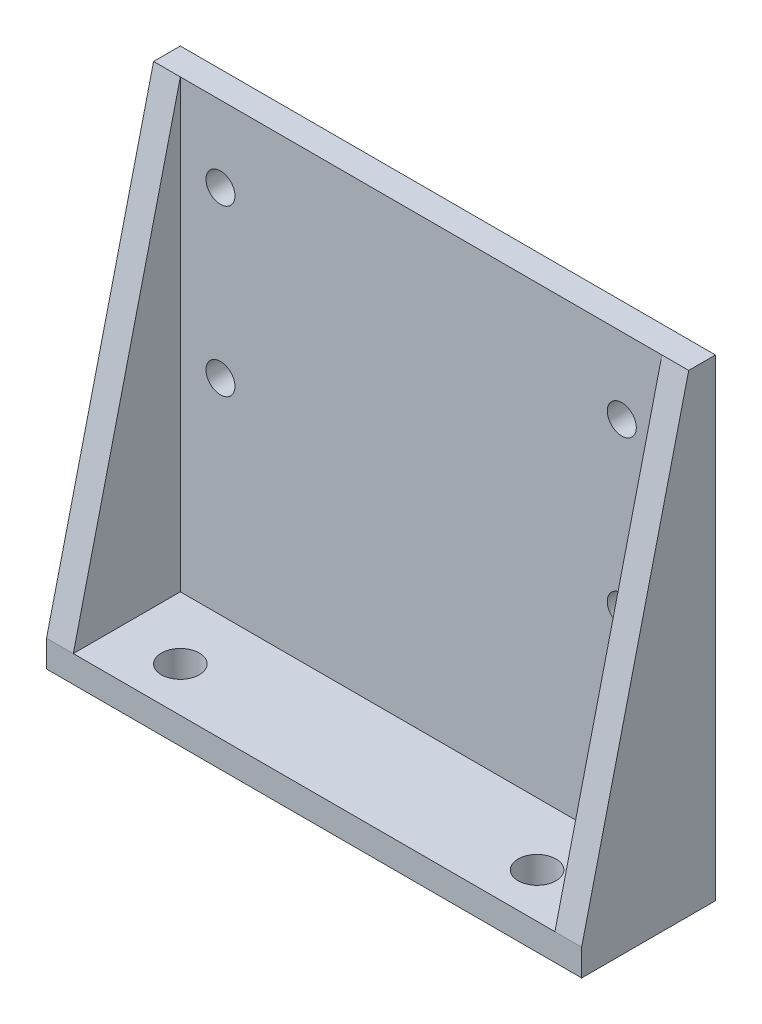
ISO-10303-21;
HEADER;
FILE_DESCRIPTION(('STEP AP214'),'2;1');
FILE_NAME('part.step','',(''),(''),'','','');
FILE_SCHEMA(('AUTOMOTIVE_DESIGN { 1 0 10303 214 1 1 1 1 }'));
ENDSEC;
DATA;
#1=APPLICATION_CONTEXT('core data for automotive mechanical design processes');
#2=APPLICATION_PROTOCOL_DEFINITION('international standard','automotive_design',2000,#1);
#3=PRODUCT_CONTEXT('',#1,'mechanical');
#4=PRODUCT('Part','Part','',(#3));
#5=PRODUCT_RELATED_PRODUCT_CATEGORY('part','',(#4));
#6=PRODUCT_DEFINITION_FORMATION('','',#4);
#7=PRODUCT_DEFINITION_CONTEXT('part definition',#1,'design');
#8=PRODUCT_DEFINITION('design','',#6,#7);
#9=PRODUCT_DEFINITION_SHAPE('','',#8);
#10=(LENGTH_UNIT() NAMED_UNIT(*) SI_UNIT(.MILLI.,.METRE.));
#11=(NAMED_UNIT(*) PLANE_ANGLE_UNIT() SI_UNIT($,.RADIAN.));
#12=(NAMED_UNIT(*) SI_UNIT($,.STERADIAN.) SOLID_ANGLE_UNIT());
#13=UNCERTAINTY_MEASURE_WITH_UNIT(LENGTH_MEASURE(1.E-05),#10,'distance_accuracy_value','');
#14=(GEOMETRIC_REPRESENTATION_CONTEXT(3) GLOBAL_UNCERTAINTY_ASSIGNED_CONTEXT((#13)) GLOBAL_UNIT_ASSIGNED_CONTEXT((#10,
#11,#12)) REPRESENTATION_CONTEXT('',''));
#15=CARTESIAN_POINT('',(0.,0.,0.));
#16=DIRECTION('',(0.,0.,1.));
#17=DIRECTION('',(1.,0.,0.));
#18=AXIS2_PLACEMENT_3D('',#15,#16,#17);
#19=CARTESIAN_POINT('',(0.,3.,0.));
#20=DIRECTION('',(0.,-1.,0.));
#21=DIRECTION('',(0.,0.,-1.));
#22=AXIS2_PLACEMENT_3D('',#19,#20,#21);
#23=PLANE('',#22);
#24=CARTESIAN_POINT('',(10.,3.,-5.));
#25=DIRECTION('',(0.,1.,0.));
#26=DIRECTION('',(0.,0.,1.));
#27=AXIS2_PLACEMENT_3D('',#24,#25,#26);
#28=CIRCLE('',#27,2.125);
#29=CARTESIAN_POINT('',(10.,3.,-2.875));
#30=VERTEX_POINT('',#29);
#31=EDGE_CURVE('E161',#30,#30,#28,.T.);
#32=ORIENTED_EDGE('',*,*,#31,.F.);
#33=EDGE_LOOP('',(#32));
#34=FACE_BOUND('',#33,.T.);
#35=CARTESIAN_POINT('',(50.,3.,-5.00000000000001));
#36=DIRECTION('',(0.,1.,0.));
#37=DIRECTION('',(0.,0.,-1.));
#38=AXIS2_PLACEMENT_3D('',#35,#36,#37);
#39=CIRCLE('',#38,2.125);
#40=CARTESIAN_POINT('',(50.,3.,-7.12500000000001));
#41=VERTEX_POINT('',#40);
#42=EDGE_CURVE('E155',#41,#41,#39,.T.);
#43=ORIENTED_EDGE('',*,*,#42,.F.);
#44=EDGE_LOOP('',(#43));
#45=FACE_BOUND('',#44,.T.);
#46=DIRECTION('',(0.,0.,1.));
#47=VECTOR('',#46,1.);
#48=CARTESIAN_POINT('',(57.,3.,0.));
#49=LINE('',#48,#47);
#50=CARTESIAN_POINT('',(57.,3.,-12.));
#51=VERTEX_POINT('',#50);
#52=CARTESIAN_POINT('',(57.,3.,0.));
#53=VERTEX_POINT('',#52);
#54=EDGE_CURVE('E112',#51,#53,#49,.T.);
#55=ORIENTED_EDGE('',*,*,#54,.F.);
#56=DIRECTION('',(-1.,0.,0.));
#57=VECTOR('',#56,1.);
#58=CARTESIAN_POINT('',(60.,3.,-12.));
#59=LINE('',#58,#57);
#60=CARTESIAN_POINT('',(3.,3.,-12.));
#61=VERTEX_POINT('',#60);
#62=EDGE_CURVE('E134',#51,#61,#59,.T.);
#63=ORIENTED_EDGE('',*,*,#62,.T.);
#64=DIRECTION('',(0.,0.,1.));
#65=VECTOR('',#64,1.);
#66=CARTESIAN_POINT('',(3.,3.,0.));
#67=LINE('',#66,#65);
#68=CARTESIAN_POINT('',(3.,3.,0.));
#69=VERTEX_POINT('',#68);
#70=EDGE_CURVE('E230',#61,#69,#67,.T.);
#71=ORIENTED_EDGE('',*,*,#70,.T.);
#72=DIRECTION('',(1.,0.,0.));
#73=VECTOR('',#72,1.);
#74=CARTESIAN_POINT('',(0.,3.,0.));
#75=LINE('',#74,#73);
#76=EDGE_CURVE('E170',#69,#53,#75,.T.);
#77=ORIENTED_EDGE('',*,*,#76,.T.);
#78=EDGE_LOOP('',(#55,#63,#71,#77));
#79=FACE_BOUND('',#78,.T.);
#80=ADVANCED_FACE('F41',(#34,#45,#79),#23,.F.);
#81=CARTESIAN_POINT('',(0.,0.,-12.));
#82=DIRECTION('',(0.,0.,1.));
#83=DIRECTION('',(1.,0.,0.));
#84=AXIS2_PLACEMENT_3D('',#81,#82,#83);
#85=PLANE('',#84);
#86=CARTESIAN_POINT('',(7.50000000000001,44.5,-12.));
#87=DIRECTION('',(0.,0.,-1.));
#88=DIRECTION('',(1.,0.,0.));
#89=AXIS2_PLACEMENT_3D('',#86,#87,#88);
#90=CIRCLE('',#89,1.625);
#91=CARTESIAN_POINT('',(9.12500000000001,44.5,-12.));
#92=VERTEX_POINT('',#91);
#93=EDGE_CURVE('E218',#92,#92,#90,.T.);
#94=ORIENTED_EDGE('',*,*,#93,.T.);
#95=EDGE_LOOP('',(#94));
#96=FACE_BOUND('',#95,.T.);
#97=CARTESIAN_POINT('',(7.5,26.,-12.));
#98=DIRECTION('',(0.,0.,-1.));
#99=DIRECTION('',(1.,0.,0.));
#100=AXIS2_PLACEMENT_3D('',#97,#98,#99);
#101=CIRCLE('',#100,1.625);
#102=CARTESIAN_POINT('',(9.125,26.,-12.));
#103=VERTEX_POINT('',#102);
#104=EDGE_CURVE('E215',#103,#103,#101,.T.);
#105=ORIENTED_EDGE('',*,*,#104,.T.);
#106=EDGE_LOOP('',(#105));
#107=FACE_BOUND('',#106,.T.);
#108=CARTESIAN_POINT('',(52.5,26.,-12.));
#109=DIRECTION('',(0.,0.,-1.));
#110=DIRECTION('',(-1.,0.,0.));
#111=AXIS2_PLACEMENT_3D('',#108,#109,#110);
#112=CIRCLE('',#111,1.625);
#113=CARTESIAN_POINT('',(50.875,26.,-12.));
#114=VERTEX_POINT('',#113);
#115=EDGE_CURVE('E209',#114,#114,#112,.T.);
#116=ORIENTED_EDGE('',*,*,#115,.T.);
#117=EDGE_LOOP('',(#116));
#118=FACE_BOUND('',#117,.T.);
#119=CARTESIAN_POINT('',(52.5,44.5,-12.));
#120=DIRECTION('',(0.,0.,-1.));
#121=DIRECTION('',(-1.,0.,0.));
#122=AXIS2_PLACEMENT_3D('',#119,#120,#121);
#123=CIRCLE('',#122,1.625);
#124=CARTESIAN_POINT('',(50.875,44.5,-12.));
#125=VERTEX_POINT('',#124);
#126=EDGE_CURVE('E149',#125,#125,#123,.T.);
#127=ORIENTED_EDGE('',*,*,#126,.T.);
#128=EDGE_LOOP('',(#127));
#129=FACE_BOUND('',#128,.T.);
#130=ORIENTED_EDGE('',*,*,#62,.F.);
#131=DIRECTION('',(0.,-1.,0.));
#132=VECTOR('',#131,1.);
#133=CARTESIAN_POINT('',(57.,3.,-12.));
#134=LINE('',#133,#132);
#135=CARTESIAN_POINT('',(57.,53.,-12.));
#136=VERTEX_POINT('',#135);
#137=EDGE_CURVE('E110',#136,#51,#134,.T.);
#138=ORIENTED_EDGE('',*,*,#137,.F.);
#139=DIRECTION('',(1.,0.,0.));
#140=VECTOR('',#139,1.);
#141=CARTESIAN_POINT('',(60.,53.,-12.));
#142=LINE('',#141,#140);
#143=CARTESIAN_POINT('',(3.,53.,-12.));
#144=VERTEX_POINT('',#143);
#145=EDGE_CURVE('E132',#144,#136,#142,.T.);
#146=ORIENTED_EDGE('',*,*,#145,.F.);
#147=DIRECTION('',(0.,-1.,0.));
#148=VECTOR('',#147,1.);
#149=CARTESIAN_POINT('',(3.,3.,-12.));
#150=LINE('',#149,#148);
#151=EDGE_CURVE('E227',#144,#61,#150,.T.);
#152=ORIENTED_EDGE('',*,*,#151,.T.);
#153=EDGE_LOOP('',(#130,#138,#146,#152));
#154=FACE_BOUND('',#153,.T.);
#155=ADVANCED_FACE('F130',(#96,#107,#118,#129,#154),#85,.T.);
#156=CARTESIAN_POINT('',(0.,0.,0.));
#157=DIRECTION('',(0.,-1.,0.));
#158=DIRECTION('',(0.,0.,-1.));
#159=AXIS2_PLACEMENT_3D('',#156,#157,#158);
#160=PLANE('',#159);
#161=CARTESIAN_POINT('',(10.,0.,-5.));
#162=DIRECTION('',(0.,1.,0.));
#163=DIRECTION('',(0.,0.,1.));
#164=AXIS2_PLACEMENT_3D('',#161,#162,#163);
#165=CIRCLE('',#164,2.125);
#166=CARTESIAN_POINT('',(10.,0.,-2.875));
#167=VERTEX_POINT('',#166);
#168=EDGE_CURVE('E158',#167,#167,#165,.T.);
#169=ORIENTED_EDGE('',*,*,#168,.T.);
#170=EDGE_LOOP('',(#169));
#171=FACE_BOUND('',#170,.T.);
#172=DIRECTION('',(0.,0.,1.));
#173=VECTOR('',#172,1.);
#174=CARTESIAN_POINT('',(0.,0.,0.));
#175=LINE('',#174,#173);
#176=CARTESIAN_POINT('',(0.,0.,-15.));
#177=VERTEX_POINT('',#176);
#178=CARTESIAN_POINT('',(0.,0.,0.));
#179=VERTEX_POINT('',#178);
#180=EDGE_CURVE('E164',#177,#179,#175,.T.);
#181=ORIENTED_EDGE('',*,*,#180,.F.);
#182=DIRECTION('',(-1.,0.,0.));
#183=VECTOR('',#182,1.);
#184=CARTESIAN_POINT('',(0.,0.,-15.));
#185=LINE('',#184,#183);
#186=CARTESIAN_POINT('',(60.,0.,-15.));
#187=VERTEX_POINT('',#186);
#188=EDGE_CURVE('E56',#187,#177,#185,.T.);
#189=ORIENTED_EDGE('',*,*,#188,.F.);
#190=DIRECTION('',(0.,0.,-1.));
#191=VECTOR('',#190,1.);
#192=CARTESIAN_POINT('',(60.,0.,0.));
#193=LINE('',#192,#191);
#194=CARTESIAN_POINT('',(60.,0.,0.));
#195=VERTEX_POINT('',#194);
#196=EDGE_CURVE('E64',#195,#187,#193,.T.);
#197=ORIENTED_EDGE('',*,*,#196,.F.);
#198=DIRECTION('',(1.,0.,0.));
#199=VECTOR('',#198,1.);
#200=CARTESIAN_POINT('',(0.,0.,0.));
#201=LINE('',#200,#199);
#202=EDGE_CURVE('E173',#179,#195,#201,.T.);
#203=ORIENTED_EDGE('',*,*,#202,.F.);
#204=EDGE_LOOP('',(#181,#189,#197,#203));
#205=FACE_BOUND('',#204,.T.);
#206=CARTESIAN_POINT('',(50.,0.,-5.00000000000001));
#207=DIRECTION('',(0.,1.,0.));
#208=DIRECTION('',(0.,0.,-1.));
#209=AXIS2_PLACEMENT_3D('',#206,#207,#208);
#210=CIRCLE('',#209,2.125);
#211=CARTESIAN_POINT('',(50.,0.,-7.12500000000001));
#212=VERTEX_POINT('',#211);
#213=EDGE_CURVE('E152',#212,#212,#210,.T.);
#214=ORIENTED_EDGE('',*,*,#213,.T.);
#215=EDGE_LOOP('',(#214));
#216=FACE_BOUND('',#215,.T.);
#217=ADVANCED_FACE('F184',(#171,#205,#216),#160,.T.);
#218=CARTESIAN_POINT('',(0.,3.,0.));
#219=DIRECTION('',(1.,0.,0.));
#220=DIRECTION('',(0.,0.,-1.));
#221=AXIS2_PLACEMENT_3D('',#218,#219,#220);
#222=PLANE('',#221);
#223=DIRECTION('',(0.,-1.,0.));
#224=VECTOR('',#223,1.);
#225=CARTESIAN_POINT('',(0.,3.,0.));
#226=LINE('',#225,#224);
#227=CARTESIAN_POINT('',(0.,3.,0.));
#228=VERTEX_POINT('',#227);
#229=EDGE_CURVE('E11',#228,#179,#226,.T.);
#230=ORIENTED_EDGE('',*,*,#229,.F.);
#231=DIRECTION('',(0.,0.972387301980517,-0.233372952475324));
#232=VECTOR('',#231,1.);
#233=CARTESIAN_POINT('',(0.,53.,-12.));
#234=LINE('',#233,#232);
#235=CARTESIAN_POINT('',(0.,53.,-12.));
#236=VERTEX_POINT('',#235);
#237=EDGE_CURVE('E225',#228,#236,#234,.T.);
#238=ORIENTED_EDGE('',*,*,#237,.T.);
#239=DIRECTION('',(0.,0.,-1.));
#240=VECTOR('',#239,1.);
#241=CARTESIAN_POINT('',(0.,53.,-12.));
#242=LINE('',#241,#240);
#243=CARTESIAN_POINT('',(0.,53.,-15.));
#244=VERTEX_POINT('',#243);
#245=EDGE_CURVE('E142',#236,#244,#242,.T.);
#246=ORIENTED_EDGE('',*,*,#245,.T.);
#247=DIRECTION('',(0.,-1.,0.));
#248=VECTOR('',#247,1.);
#249=CARTESIAN_POINT('',(0.,3.,-15.));
#250=LINE('',#249,#248);
#251=EDGE_CURVE('E169',#244,#177,#250,.T.);
#252=ORIENTED_EDGE('',*,*,#251,.T.);
#253=ORIENTED_EDGE('',*,*,#180,.T.);
#254=EDGE_LOOP('',(#230,#238,#246,#252,#253));
#255=FACE_BOUND('',#254,.T.);
#256=ADVANCED_FACE('F43',(#255),#222,.F.);
#257=CARTESIAN_POINT('',(0.,3.,0.));
#258=DIRECTION('',(0.,0.,-1.));
#259=DIRECTION('',(-1.,0.,0.));
#260=AXIS2_PLACEMENT_3D('',#257,#258,#259);
#261=PLANE('',#260);
#262=ORIENTED_EDGE('',*,*,#202,.T.);
#263=DIRECTION('',(0.,-1.,0.));
#264=VECTOR('',#263,1.);
#265=CARTESIAN_POINT('',(60.,3.,0.));
#266=LINE('',#265,#264);
#267=CARTESIAN_POINT('',(60.,3.,0.));
#268=VERTEX_POINT('',#267);
#269=EDGE_CURVE('E49',#268,#195,#266,.T.);
#270=ORIENTED_EDGE('',*,*,#269,.F.);
#271=DIRECTION('',(1.,0.,0.));
#272=VECTOR('',#271,1.);
#273=CARTESIAN_POINT('',(57.,3.,0.));
#274=LINE('',#273,#272);
#275=EDGE_CURVE('E125',#53,#268,#274,.T.);
#276=ORIENTED_EDGE('',*,*,#275,.F.);
#277=ORIENTED_EDGE('',*,*,#76,.F.);
#278=EDGE_CURVE('E167',#228,#69,#75,.T.);
#279=ORIENTED_EDGE('',*,*,#278,.F.);
#280=ORIENTED_EDGE('',*,*,#229,.T.);
#281=EDGE_LOOP('',(#262,#270,#276,#277,#279,#280));
#282=FACE_BOUND('',#281,.T.);
#283=ADVANCED_FACE('F238',(#282),#261,.F.);
#284=CARTESIAN_POINT('',(60.,3.,0.));
#285=DIRECTION('',(-1.,0.,0.));
#286=DIRECTION('',(0.,0.,1.));
#287=AXIS2_PLACEMENT_3D('',#284,#285,#286);
#288=PLANE('',#287);
#289=ORIENTED_EDGE('',*,*,#196,.T.);
#290=DIRECTION('',(0.,-1.,0.));
#291=VECTOR('',#290,1.);
#292=CARTESIAN_POINT('',(60.,3.,-15.));
#293=LINE('',#292,#291);
#294=CARTESIAN_POINT('',(60.,53.,-15.));
#295=VERTEX_POINT('',#294);
#296=EDGE_CURVE('E178',#295,#187,#293,.T.);
#297=ORIENTED_EDGE('',*,*,#296,.F.);
#298=DIRECTION('',(0.,0.,-1.));
#299=VECTOR('',#298,1.);
#300=CARTESIAN_POINT('',(60.,53.,-12.));
#301=LINE('',#300,#299);
#302=CARTESIAN_POINT('',(60.,53.,-12.));
#303=VERTEX_POINT('',#302);
#304=EDGE_CURVE('E150',#303,#295,#301,.T.);
#305=ORIENTED_EDGE('',*,*,#304,.F.);
#306=DIRECTION('',(0.,0.972387301980517,-0.233372952475324));
#307=VECTOR('',#306,1.);
#308=CARTESIAN_POINT('',(60.,53.,-12.));
#309=LINE('',#308,#307);
#310=EDGE_CURVE('E120',#268,#303,#309,.T.);
#311=ORIENTED_EDGE('',*,*,#310,.F.);
#312=ORIENTED_EDGE('',*,*,#269,.T.);
#313=EDGE_LOOP('',(#289,#297,#305,#311,#312));
#314=FACE_BOUND('',#313,.T.);
#315=ADVANCED_FACE('F180',(#314),#288,.F.);
#316=CARTESIAN_POINT('',(0.,3.,-15.));
#317=DIRECTION('',(0.,0.,1.));
#318=DIRECTION('',(1.,0.,0.));
#319=AXIS2_PLACEMENT_3D('',#316,#317,#318);
#320=PLANE('',#319);
#321=ORIENTED_EDGE('',*,*,#188,.T.);
#322=ORIENTED_EDGE('',*,*,#251,.F.);
#323=DIRECTION('',(1.,0.,0.));
#324=VECTOR('',#323,1.);
#325=CARTESIAN_POINT('',(60.,53.,-15.));
#326=LINE('',#325,#324);
#327=EDGE_CURVE('E143',#244,#295,#326,.T.);
#328=ORIENTED_EDGE('',*,*,#327,.T.);
#329=ORIENTED_EDGE('',*,*,#296,.T.);
#330=EDGE_LOOP('',(#321,#322,#328,#329));
#331=FACE_BOUND('',#330,.T.);
#332=CARTESIAN_POINT('',(7.50000000000001,44.5,-15.));
#333=DIRECTION('',(0.,0.,-1.));
#334=DIRECTION('',(1.,0.,0.));
#335=AXIS2_PLACEMENT_3D('',#332,#333,#334);
#336=CIRCLE('',#335,1.625);
#337=CARTESIAN_POINT('',(9.12500000000001,44.5,-15.));
#338=VERTEX_POINT('',#337);
#339=EDGE_CURVE('E196',#338,#338,#336,.T.);
#340=ORIENTED_EDGE('',*,*,#339,.F.);
#341=EDGE_LOOP('',(#340));
#342=FACE_BOUND('',#341,.T.);
#343=CARTESIAN_POINT('',(7.5,26.,-15.));
#344=DIRECTION('',(0.,0.,-1.));
#345=DIRECTION('',(1.,0.,0.));
#346=AXIS2_PLACEMENT_3D('',#343,#344,#345);
#347=CIRCLE('',#346,1.625);
#348=CARTESIAN_POINT('',(9.125,26.,-15.));
#349=VERTEX_POINT('',#348);
#350=EDGE_CURVE('E200',#349,#349,#347,.T.);
#351=ORIENTED_EDGE('',*,*,#350,.F.);
#352=EDGE_LOOP('',(#351));
#353=FACE_BOUND('',#352,.T.);
#354=CARTESIAN_POINT('',(52.5,26.,-15.));
#355=DIRECTION('',(0.,0.,-1.));
#356=DIRECTION('',(-1.,0.,0.));
#357=AXIS2_PLACEMENT_3D('',#354,#355,#356);
#358=CIRCLE('',#357,1.625);
#359=CARTESIAN_POINT('',(50.875,26.,-15.));
#360=VERTEX_POINT('',#359);
#361=EDGE_CURVE('E204',#360,#360,#358,.T.);
#362=ORIENTED_EDGE('',*,*,#361,.F.);
#363=EDGE_LOOP('',(#362));
#364=FACE_BOUND('',#363,.T.);
#365=CARTESIAN_POINT('',(52.5,44.5,-15.));
#366=DIRECTION('',(0.,0.,-1.));
#367=DIRECTION('',(-1.,0.,0.));
#368=AXIS2_PLACEMENT_3D('',#365,#366,#367);
#369=CIRCLE('',#368,1.625);
#370=CARTESIAN_POINT('',(50.875,44.5,-15.));
#371=VERTEX_POINT('',#370);
#372=EDGE_CURVE('E207',#371,#371,#369,.T.);
#373=ORIENTED_EDGE('',*,*,#372,.F.);
#374=EDGE_LOOP('',(#373));
#375=FACE_BOUND('',#374,.T.);
#376=ADVANCED_FACE('F188',(#331,#342,#353,#364,#375),#320,.F.);
#377=CARTESIAN_POINT('',(10.,3.,-5.));
#378=DIRECTION('',(0.,-1.,0.));
#379=DIRECTION('',(0.,0.,-1.));
#380=AXIS2_PLACEMENT_3D('',#377,#378,#379);
#381=CYLINDRICAL_SURFACE('',#380,2.125);
#382=ORIENTED_EDGE('',*,*,#31,.T.);
#383=EDGE_LOOP('',(#382));
#384=FACE_BOUND('',#383,.T.);
#385=ORIENTED_EDGE('',*,*,#168,.F.);
#386=EDGE_LOOP('',(#385));
#387=FACE_BOUND('',#386,.T.);
#388=ADVANCED_FACE('F191',(#384,#387),#381,.F.);
#389=CARTESIAN_POINT('',(50.,3.,-5.00000000000001));
#390=DIRECTION('',(0.,-1.,0.));
#391=DIRECTION('',(0.,0.,-1.));
#392=AXIS2_PLACEMENT_3D('',#389,#390,#391);
#393=CYLINDRICAL_SURFACE('',#392,2.125);
#394=ORIENTED_EDGE('',*,*,#42,.T.);
#395=EDGE_LOOP('',(#394));
#396=FACE_BOUND('',#395,.T.);
#397=ORIENTED_EDGE('',*,*,#213,.F.);
#398=EDGE_LOOP('',(#397));
#399=FACE_BOUND('',#398,.T.);
#400=ADVANCED_FACE('F323',(#396,#399),#393,.F.);
#401=CARTESIAN_POINT('',(60.,53.,-12.));
#402=DIRECTION('',(0.,1.,0.));
#403=DIRECTION('',(0.,0.,1.));
#404=AXIS2_PLACEMENT_3D('',#401,#402,#403);
#405=PLANE('',#404);
#406=ORIENTED_EDGE('',*,*,#327,.F.);
#407=ORIENTED_EDGE('',*,*,#245,.F.);
#408=EDGE_CURVE('E140',#236,#144,#142,.T.);
#409=ORIENTED_EDGE('',*,*,#408,.T.);
#410=ORIENTED_EDGE('',*,*,#145,.T.);
#411=DIRECTION('',(1.,0.,0.));
#412=VECTOR('',#411,1.);
#413=CARTESIAN_POINT('',(57.,53.,-12.));
#414=LINE('',#413,#412);
#415=EDGE_CURVE('E117',#136,#303,#414,.T.);
#416=ORIENTED_EDGE('',*,*,#415,.T.);
#417=ORIENTED_EDGE('',*,*,#304,.T.);
#418=EDGE_LOOP('',(#406,#407,#409,#410,#416,#417));
#419=FACE_BOUND('',#418,.T.);
#420=ADVANCED_FACE('F137',(#419),#405,.T.);
#421=CARTESIAN_POINT('',(52.5,44.5,-12.));
#422=DIRECTION('',(0.,0.,-1.));
#423=DIRECTION('',(-1.,0.,0.));
#424=AXIS2_PLACEMENT_3D('',#421,#422,#423);
#425=CYLINDRICAL_SURFACE('',#424,1.625);
#426=ORIENTED_EDGE('',*,*,#126,.F.);
#427=EDGE_LOOP('',(#426));
#428=FACE_BOUND('',#427,.T.);
#429=ORIENTED_EDGE('',*,*,#372,.T.);
#430=EDGE_LOOP('',(#429));
#431=FACE_BOUND('',#430,.T.);
#432=ADVANCED_FACE('F302',(#428,#431),#425,.F.);
#433=CARTESIAN_POINT('',(52.5,26.,-12.));
#434=DIRECTION('',(0.,0.,-1.));
#435=DIRECTION('',(-1.,0.,0.));
#436=AXIS2_PLACEMENT_3D('',#433,#434,#435);
#437=CYLINDRICAL_SURFACE('',#436,1.625);
#438=ORIENTED_EDGE('',*,*,#115,.F.);
#439=EDGE_LOOP('',(#438));
#440=FACE_BOUND('',#439,.T.);
#441=ORIENTED_EDGE('',*,*,#361,.T.);
#442=EDGE_LOOP('',(#441));
#443=FACE_BOUND('',#442,.T.);
#444=ADVANCED_FACE('F293',(#440,#443),#437,.F.);
#445=CARTESIAN_POINT('',(7.5,26.,-12.));
#446=DIRECTION('',(0.,0.,-1.));
#447=DIRECTION('',(-1.,0.,0.));
#448=AXIS2_PLACEMENT_3D('',#445,#446,#447);
#449=CYLINDRICAL_SURFACE('',#448,1.625);
#450=ORIENTED_EDGE('',*,*,#104,.F.);
#451=EDGE_LOOP('',(#450));
#452=FACE_BOUND('',#451,.T.);
#453=ORIENTED_EDGE('',*,*,#350,.T.);
#454=EDGE_LOOP('',(#453));
#455=FACE_BOUND('',#454,.T.);
#456=ADVANCED_FACE('F256',(#452,#455),#449,.F.);
#457=CARTESIAN_POINT('',(7.50000000000001,44.5,-12.));
#458=DIRECTION('',(0.,0.,-1.));
#459=DIRECTION('',(-1.,0.,0.));
#460=AXIS2_PLACEMENT_3D('',#457,#458,#459);
#461=CYLINDRICAL_SURFACE('',#460,1.625);
#462=ORIENTED_EDGE('',*,*,#93,.F.);
#463=EDGE_LOOP('',(#462));
#464=FACE_BOUND('',#463,.T.);
#465=ORIENTED_EDGE('',*,*,#339,.T.);
#466=EDGE_LOOP('',(#465));
#467=FACE_BOUND('',#466,.T.);
#468=ADVANCED_FACE('F248',(#464,#467),#461,.F.);
#469=CARTESIAN_POINT('',(3.,53.,-12.));
#470=DIRECTION('',(0.,0.233372952475324,0.972387301980517));
#471=DIRECTION('',(0.,-0.972387301980518,0.233372952475324));
#472=AXIS2_PLACEMENT_3D('',#469,#470,#471);
#473=PLANE('',#472);
#474=ORIENTED_EDGE('',*,*,#237,.F.);
#475=ORIENTED_EDGE('',*,*,#278,.T.);
#476=DIRECTION('',(0.,0.972387301980517,-0.233372952475324));
#477=VECTOR('',#476,1.);
#478=CARTESIAN_POINT('',(3.,53.,-12.));
#479=LINE('',#478,#477);
#480=EDGE_CURVE('E222',#69,#144,#479,.T.);
#481=ORIENTED_EDGE('',*,*,#480,.T.);
#482=ORIENTED_EDGE('',*,*,#408,.F.);
#483=EDGE_LOOP('',(#474,#475,#481,#482));
#484=FACE_BOUND('',#483,.T.);
#485=ADVANCED_FACE('F246',(#484),#473,.T.);
#486=CARTESIAN_POINT('',(3.,0.,0.));
#487=DIRECTION('',(-1.,0.,0.));
#488=DIRECTION('',(0.,0.,1.));
#489=AXIS2_PLACEMENT_3D('',#486,#487,#488);
#490=PLANE('',#489);
#491=ORIENTED_EDGE('',*,*,#151,.F.);
#492=ORIENTED_EDGE('',*,*,#480,.F.);
#493=ORIENTED_EDGE('',*,*,#70,.F.);
#494=EDGE_LOOP('',(#491,#492,#493));
#495=FACE_BOUND('',#494,.T.);
#496=ADVANCED_FACE('F244',(#495),#490,.F.);
#497=CARTESIAN_POINT('',(57.,53.,-12.));
#498=DIRECTION('',(0.,-0.233372952475324,-0.972387301980517));
#499=DIRECTION('',(0.,0.972387301980518,-0.233372952475324));
#500=AXIS2_PLACEMENT_3D('',#497,#498,#499);
#501=PLANE('',#500);
#502=ORIENTED_EDGE('',*,*,#310,.T.);
#503=ORIENTED_EDGE('',*,*,#415,.F.);
#504=DIRECTION('',(0.,0.972387301980517,-0.233372952475324));
#505=VECTOR('',#504,1.);
#506=CARTESIAN_POINT('',(57.,53.,-12.));
#507=LINE('',#506,#505);
#508=EDGE_CURVE('E106',#53,#136,#507,.T.);
#509=ORIENTED_EDGE('',*,*,#508,.F.);
#510=ORIENTED_EDGE('',*,*,#275,.T.);
#511=EDGE_LOOP('',(#502,#503,#509,#510));
#512=FACE_BOUND('',#511,.T.);
#513=ADVANCED_FACE('F118',(#512),#501,.F.);
#514=CARTESIAN_POINT('',(57.,0.,0.));
#515=DIRECTION('',(1.,0.,0.));
#516=DIRECTION('',(0.,0.,1.));
#517=AXIS2_PLACEMENT_3D('',#514,#515,#516);
#518=PLANE('',#517);
#519=ORIENTED_EDGE('',*,*,#137,.T.);
#520=ORIENTED_EDGE('',*,*,#54,.T.);
#521=ORIENTED_EDGE('',*,*,#508,.T.);
#522=EDGE_LOOP('',(#519,#520,#521));
#523=FACE_BOUND('',#522,.T.);
#524=ADVANCED_FACE('F108',(#523),#518,.F.);
#525=CLOSED_SHELL('',(#80,#155,#217,#256,#283,#315,#376,#388,#400,#420,#432,#444,#456,#468,#485,
#496,#513,#524));
#526=MANIFOLD_SOLID_BREP('B2',#525);
#527=ADVANCED_BREP_SHAPE_REPRESENTATION('',(#18,#526),#14);
#528=SHAPE_DEFINITION_REPRESENTATION(#9,#527);
ENDSEC;
END-ISO-10303-21;
